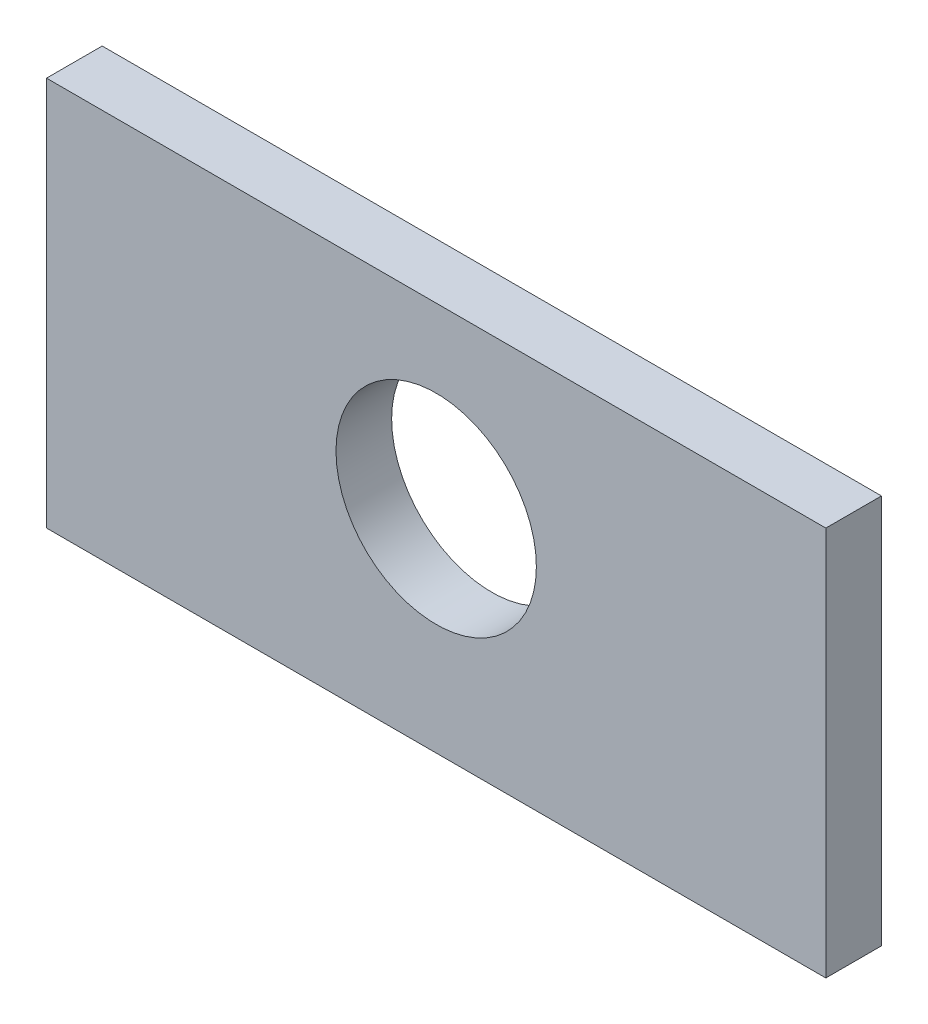
ISO-10303-21;
HEADER;
FILE_DESCRIPTION(('STEP AP214'),'2;1');
FILE_NAME('part.step','',(''),(''),'','','');
FILE_SCHEMA(('AUTOMOTIVE_DESIGN { 1 0 10303 214 1 1 1 1 }'));
ENDSEC;
DATA;
#1=APPLICATION_CONTEXT('core data for automotive mechanical design processes');
#2=APPLICATION_PROTOCOL_DEFINITION('international standard','automotive_design',2000,#1);
#3=PRODUCT_CONTEXT('',#1,'mechanical');
#4=PRODUCT('Part','Part','',(#3));
#5=PRODUCT_RELATED_PRODUCT_CATEGORY('part','',(#4));
#6=PRODUCT_DEFINITION_FORMATION('','',#4);
#7=PRODUCT_DEFINITION_CONTEXT('part definition',#1,'design');
#8=PRODUCT_DEFINITION('design','',#6,#7);
#9=PRODUCT_DEFINITION_SHAPE('','',#8);
#10=(LENGTH_UNIT() NAMED_UNIT(*) SI_UNIT(.MILLI.,.METRE.));
#11=(NAMED_UNIT(*) PLANE_ANGLE_UNIT() SI_UNIT($,.RADIAN.));
#12=(NAMED_UNIT(*) SI_UNIT($,.STERADIAN.) SOLID_ANGLE_UNIT());
#13=UNCERTAINTY_MEASURE_WITH_UNIT(LENGTH_MEASURE(1.E-05),#10,'distance_accuracy_value','');
#14=(GEOMETRIC_REPRESENTATION_CONTEXT(3) GLOBAL_UNCERTAINTY_ASSIGNED_CONTEXT((#13)) GLOBAL_UNIT_ASSIGNED_CONTEXT((#10,
#11,#12)) REPRESENTATION_CONTEXT('',''));
#15=CARTESIAN_POINT('',(0.,0.,0.));
#16=DIRECTION('',(0.,0.,1.));
#17=DIRECTION('',(1.,0.,0.));
#18=AXIS2_PLACEMENT_3D('',#15,#16,#17);
#19=CARTESIAN_POINT('',(0.,0.,5.));
#20=DIRECTION('',(0.,0.,-1.));
#21=DIRECTION('',(-1.,0.,0.));
#22=AXIS2_PLACEMENT_3D('',#19,#20,#21);
#23=PLANE('',#22);
#24=DIRECTION('',(0.,1.,0.));
#25=VECTOR('',#24,1.);
#26=CARTESIAN_POINT('',(70.,-35.,5.));
#27=LINE('',#26,#25);
#28=CARTESIAN_POINT('',(70.,-35.,5.));
#29=VERTEX_POINT('',#28);
#30=CARTESIAN_POINT('',(70.,35.,5.));
#31=VERTEX_POINT('',#30);
#32=EDGE_CURVE('E98',#29,#31,#27,.T.);
#33=ORIENTED_EDGE('',*,*,#32,.T.);
#34=DIRECTION('',(-1.,0.,0.));
#35=VECTOR('',#34,1.);
#36=CARTESIAN_POINT('',(-70.,35.,5.));
#37=LINE('',#36,#35);
#38=CARTESIAN_POINT('',(-70.,35.,5.));
#39=VERTEX_POINT('',#38);
#40=EDGE_CURVE('E93',#31,#39,#37,.T.);
#41=ORIENTED_EDGE('',*,*,#40,.T.);
#42=DIRECTION('',(0.,-1.,0.));
#43=VECTOR('',#42,1.);
#44=CARTESIAN_POINT('',(-70.,-35.,5.));
#45=LINE('',#44,#43);
#46=CARTESIAN_POINT('',(-70.,-35.,5.));
#47=VERTEX_POINT('',#46);
#48=EDGE_CURVE('E96',#39,#47,#45,.T.);
#49=ORIENTED_EDGE('',*,*,#48,.T.);
#50=DIRECTION('',(1.,0.,0.));
#51=VECTOR('',#50,1.);
#52=CARTESIAN_POINT('',(-70.,-35.,5.));
#53=LINE('',#52,#51);
#54=EDGE_CURVE('E63',#47,#29,#53,.T.);
#55=ORIENTED_EDGE('',*,*,#54,.T.);
#56=EDGE_LOOP('',(#33,#41,#49,#55));
#57=FACE_BOUND('',#56,.T.);
#58=CARTESIAN_POINT('',(0.,3.,5.));
#59=DIRECTION('',(0.,0.,1.));
#60=DIRECTION('',(1.,0.,0.));
#61=AXIS2_PLACEMENT_3D('',#58,#59,#60);
#62=CIRCLE('',#61,18.);
#63=CARTESIAN_POINT('',(18.,3.,5.));
#64=VERTEX_POINT('',#63);
#65=EDGE_CURVE('E119',#64,#64,#62,.T.);
#66=ORIENTED_EDGE('',*,*,#65,.F.);
#67=EDGE_LOOP('',(#66));
#68=FACE_BOUND('',#67,.T.);
#69=ADVANCED_FACE('F45',(#57,#68),#23,.F.);
#70=CARTESIAN_POINT('',(0.,0.,-5.));
#71=DIRECTION('',(0.,0.,-1.));
#72=DIRECTION('',(-1.,0.,0.));
#73=AXIS2_PLACEMENT_3D('',#70,#71,#72);
#74=PLANE('',#73);
#75=DIRECTION('',(0.,1.,0.));
#76=VECTOR('',#75,1.);
#77=CARTESIAN_POINT('',(70.,-35.,-5.));
#78=LINE('',#77,#76);
#79=CARTESIAN_POINT('',(70.,-35.,-5.));
#80=VERTEX_POINT('',#79);
#81=CARTESIAN_POINT('',(70.,35.,-5.));
#82=VERTEX_POINT('',#81);
#83=EDGE_CURVE('E115',#80,#82,#78,.T.);
#84=ORIENTED_EDGE('',*,*,#83,.F.);
#85=DIRECTION('',(1.,0.,0.));
#86=VECTOR('',#85,1.);
#87=CARTESIAN_POINT('',(-70.,-35.,-5.));
#88=LINE('',#87,#86);
#89=CARTESIAN_POINT('',(-70.,-35.,-5.));
#90=VERTEX_POINT('',#89);
#91=EDGE_CURVE('E86',#90,#80,#88,.T.);
#92=ORIENTED_EDGE('',*,*,#91,.F.);
#93=DIRECTION('',(0.,-1.,0.));
#94=VECTOR('',#93,1.);
#95=CARTESIAN_POINT('',(-70.,-35.,-5.));
#96=LINE('',#95,#94);
#97=CARTESIAN_POINT('',(-70.,35.,-5.));
#98=VERTEX_POINT('',#97);
#99=EDGE_CURVE('E80',#98,#90,#96,.T.);
#100=ORIENTED_EDGE('',*,*,#99,.F.);
#101=DIRECTION('',(-1.,0.,0.));
#102=VECTOR('',#101,1.);
#103=CARTESIAN_POINT('',(-70.,35.,-5.));
#104=LINE('',#103,#102);
#105=EDGE_CURVE('E103',#82,#98,#104,.T.);
#106=ORIENTED_EDGE('',*,*,#105,.F.);
#107=EDGE_LOOP('',(#84,#92,#100,#106));
#108=FACE_BOUND('',#107,.T.);
#109=CARTESIAN_POINT('',(0.,3.,-5.));
#110=DIRECTION('',(0.,0.,1.));
#111=DIRECTION('',(1.,0.,0.));
#112=AXIS2_PLACEMENT_3D('',#109,#110,#111);
#113=CIRCLE('',#112,18.);
#114=CARTESIAN_POINT('',(18.,3.,-5.));
#115=VERTEX_POINT('',#114);
#116=EDGE_CURVE('E139',#115,#115,#113,.T.);
#117=ORIENTED_EDGE('',*,*,#116,.T.);
#118=EDGE_LOOP('',(#117));
#119=FACE_BOUND('',#118,.T.);
#120=ADVANCED_FACE('F133',(#108,#119),#74,.T.);
#121=CARTESIAN_POINT('',(70.,-35.,5.));
#122=DIRECTION('',(-1.,0.,0.));
#123=DIRECTION('',(0.,-1.,0.));
#124=AXIS2_PLACEMENT_3D('',#121,#122,#123);
#125=PLANE('',#124);
#126=ORIENTED_EDGE('',*,*,#83,.T.);
#127=DIRECTION('',(0.,0.,-1.));
#128=VECTOR('',#127,1.);
#129=CARTESIAN_POINT('',(70.,35.,5.));
#130=LINE('',#129,#128);
#131=EDGE_CURVE('E11',#31,#82,#130,.T.);
#132=ORIENTED_EDGE('',*,*,#131,.F.);
#133=ORIENTED_EDGE('',*,*,#32,.F.);
#134=DIRECTION('',(0.,0.,-1.));
#135=VECTOR('',#134,1.);
#136=CARTESIAN_POINT('',(70.,-35.,5.));
#137=LINE('',#136,#135);
#138=EDGE_CURVE('E111',#29,#80,#137,.T.);
#139=ORIENTED_EDGE('',*,*,#138,.T.);
#140=EDGE_LOOP('',(#126,#132,#133,#139));
#141=FACE_BOUND('',#140,.T.);
#142=ADVANCED_FACE('F47',(#141),#125,.F.);
#143=CARTESIAN_POINT('',(-70.,35.,5.));
#144=DIRECTION('',(0.,-1.,0.));
#145=DIRECTION('',(0.,0.,-1.));
#146=AXIS2_PLACEMENT_3D('',#143,#144,#145);
#147=PLANE('',#146);
#148=ORIENTED_EDGE('',*,*,#105,.T.);
#149=DIRECTION('',(0.,0.,-1.));
#150=VECTOR('',#149,1.);
#151=CARTESIAN_POINT('',(-70.,35.,5.));
#152=LINE('',#151,#150);
#153=EDGE_CURVE('E55',#39,#98,#152,.T.);
#154=ORIENTED_EDGE('',*,*,#153,.F.);
#155=ORIENTED_EDGE('',*,*,#40,.F.);
#156=ORIENTED_EDGE('',*,*,#131,.T.);
#157=EDGE_LOOP('',(#148,#154,#155,#156));
#158=FACE_BOUND('',#157,.T.);
#159=ADVANCED_FACE('F102',(#158),#147,.F.);
#160=CARTESIAN_POINT('',(-70.,-35.,5.));
#161=DIRECTION('',(1.,0.,0.));
#162=DIRECTION('',(0.,1.,0.));
#163=AXIS2_PLACEMENT_3D('',#160,#161,#162);
#164=PLANE('',#163);
#165=ORIENTED_EDGE('',*,*,#99,.T.);
#166=DIRECTION('',(0.,0.,-1.));
#167=VECTOR('',#166,1.);
#168=CARTESIAN_POINT('',(-70.,-35.,5.));
#169=LINE('',#168,#167);
#170=EDGE_CURVE('E105',#47,#90,#169,.T.);
#171=ORIENTED_EDGE('',*,*,#170,.F.);
#172=ORIENTED_EDGE('',*,*,#48,.F.);
#173=ORIENTED_EDGE('',*,*,#153,.T.);
#174=EDGE_LOOP('',(#165,#171,#172,#173));
#175=FACE_BOUND('',#174,.T.);
#176=ADVANCED_FACE('F106',(#175),#164,.F.);
#177=CARTESIAN_POINT('',(-70.,-35.,5.));
#178=DIRECTION('',(0.,1.,0.));
#179=DIRECTION('',(0.,0.,1.));
#180=AXIS2_PLACEMENT_3D('',#177,#178,#179);
#181=PLANE('',#180);
#182=ORIENTED_EDGE('',*,*,#91,.T.);
#183=ORIENTED_EDGE('',*,*,#138,.F.);
#184=ORIENTED_EDGE('',*,*,#54,.F.);
#185=ORIENTED_EDGE('',*,*,#170,.T.);
#186=EDGE_LOOP('',(#182,#183,#184,#185));
#187=FACE_BOUND('',#186,.T.);
#188=ADVANCED_FACE('F130',(#187),#181,.F.);
#189=CARTESIAN_POINT('',(0.,3.,5.));
#190=DIRECTION('',(0.,0.,-1.));
#191=DIRECTION('',(-1.,0.,0.));
#192=AXIS2_PLACEMENT_3D('',#189,#190,#191);
#193=CYLINDRICAL_SURFACE('',#192,18.);
#194=ORIENTED_EDGE('',*,*,#65,.T.);
#195=EDGE_LOOP('',(#194));
#196=FACE_BOUND('',#195,.T.);
#197=ORIENTED_EDGE('',*,*,#116,.F.);
#198=EDGE_LOOP('',(#197));
#199=FACE_BOUND('',#198,.T.);
#200=ADVANCED_FACE('F148',(#196,#199),#193,.F.);
#201=CLOSED_SHELL('',(#69,#120,#142,#159,#176,#188,#200));
#202=MANIFOLD_SOLID_BREP('B2',#201);
#203=ADVANCED_BREP_SHAPE_REPRESENTATION('',(#18,#202),#14);
#204=SHAPE_DEFINITION_REPRESENTATION(#9,#203);
ENDSEC;
END-ISO-10303-21;
